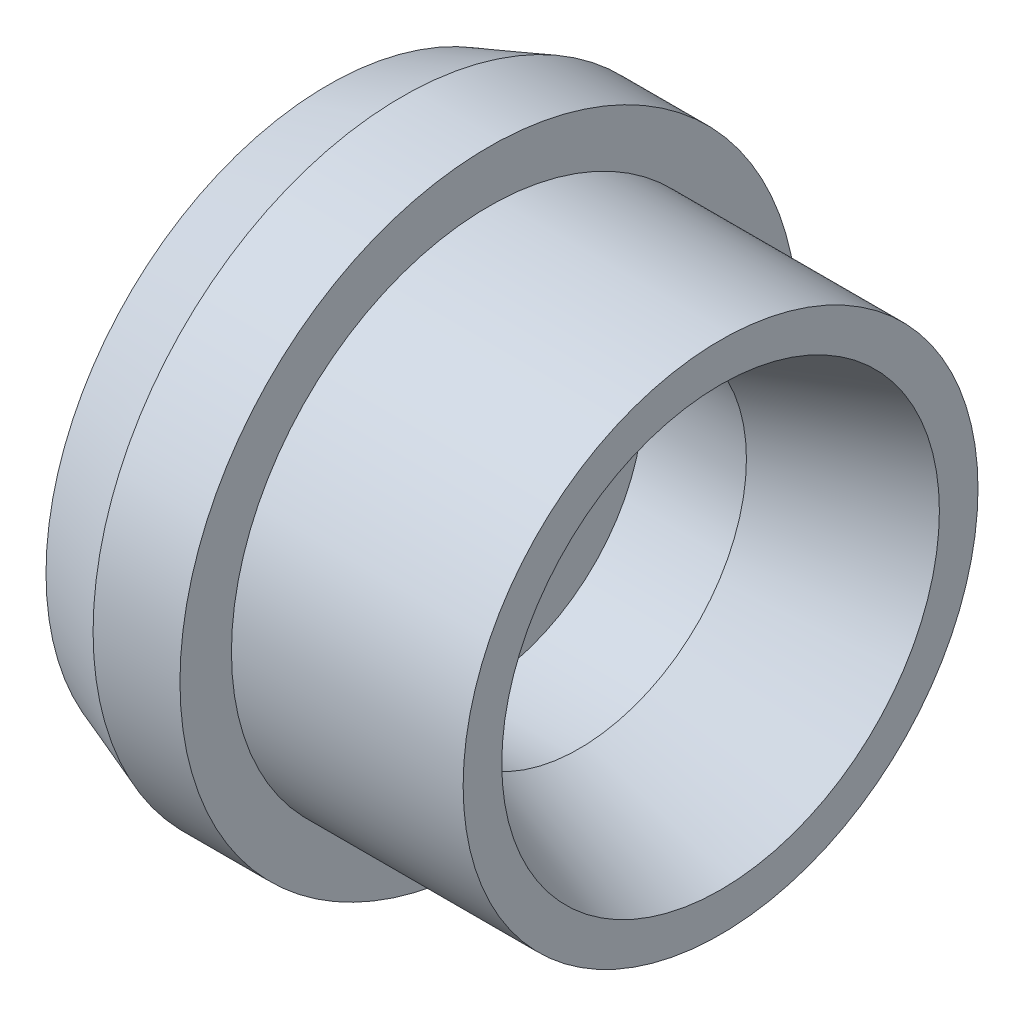
ISO-10303-21;
HEADER;
FILE_DESCRIPTION(('STEP AP214'),'2;1');
FILE_NAME('part.step','',(''),(''),'','','');
FILE_SCHEMA(('AUTOMOTIVE_DESIGN { 1 0 10303 214 1 1 1 1 }'));
ENDSEC;
DATA;
#1=APPLICATION_CONTEXT('core data for automotive mechanical design processes');
#2=APPLICATION_PROTOCOL_DEFINITION('international standard','automotive_design',2000,#1);
#3=PRODUCT_CONTEXT('',#1,'mechanical');
#4=PRODUCT('Part','Part','',(#3));
#5=PRODUCT_RELATED_PRODUCT_CATEGORY('part','',(#4));
#6=PRODUCT_DEFINITION_FORMATION('','',#4);
#7=PRODUCT_DEFINITION_CONTEXT('part definition',#1,'design');
#8=PRODUCT_DEFINITION('design','',#6,#7);
#9=PRODUCT_DEFINITION_SHAPE('','',#8);
#10=(LENGTH_UNIT() NAMED_UNIT(*) SI_UNIT(.MILLI.,.METRE.));
#11=(NAMED_UNIT(*) PLANE_ANGLE_UNIT() SI_UNIT($,.RADIAN.));
#12=(NAMED_UNIT(*) SI_UNIT($,.STERADIAN.) SOLID_ANGLE_UNIT());
#13=UNCERTAINTY_MEASURE_WITH_UNIT(LENGTH_MEASURE(1.E-05),#10,'distance_accuracy_value','');
#14=(GEOMETRIC_REPRESENTATION_CONTEXT(3) GLOBAL_UNCERTAINTY_ASSIGNED_CONTEXT((#13)) GLOBAL_UNIT_ASSIGNED_CONTEXT((#10,
#11,#12)) REPRESENTATION_CONTEXT('',''));
#15=CARTESIAN_POINT('',(0.,0.,0.));
#16=DIRECTION('',(0.,0.,1.));
#17=DIRECTION('',(1.,0.,0.));
#18=AXIS2_PLACEMENT_3D('',#15,#16,#17);
#19=CARTESIAN_POINT('',(0.,0.,0.));
#20=DIRECTION('',(-1.,0.,0.));
#21=DIRECTION('',(0.,0.,1.));
#22=AXIS2_PLACEMENT_3D('',#19,#20,#21);
#23=PLANE('',#22);
#24=CARTESIAN_POINT('',(0.,0.,0.));
#25=DIRECTION('',(1.,0.,0.));
#26=DIRECTION('',(0.,0.,-1.));
#27=AXIS2_PLACEMENT_3D('',#24,#25,#26);
#28=CIRCLE('',#27,5.56442147285421);
#29=CARTESIAN_POINT('',(0.,0.,-5.56442147285421));
#30=VERTEX_POINT('',#29);
#31=EDGE_CURVE('E10',#30,#30,#28,.T.);
#32=ORIENTED_EDGE('',*,*,#31,.F.);
#33=EDGE_LOOP('',(#32));
#34=FACE_BOUND('',#33,.T.);
#35=ADVANCED_FACE('F34',(#34),#23,.T.);
#36=CARTESIAN_POINT('',(1.4605,0.,0.));
#37=DIRECTION('',(1.,0.,0.));
#38=DIRECTION('',(0.,0.,-1.));
#39=AXIS2_PLACEMENT_3D('',#36,#37,#38);
#40=CONICAL_SURFACE('',#39,6.096,0.349065850398867);
#41=ORIENTED_EDGE('',*,*,#31,.T.);
#42=EDGE_LOOP('',(#41));
#43=FACE_BOUND('',#42,.T.);
#44=CARTESIAN_POINT('',(1.4605,0.,0.));
#45=DIRECTION('',(1.,0.,0.));
#46=DIRECTION('',(0.,0.,-1.));
#47=AXIS2_PLACEMENT_3D('',#44,#45,#46);
#48=CIRCLE('',#47,6.096);
#49=CARTESIAN_POINT('',(1.4605,0.,-6.096));
#50=VERTEX_POINT('',#49);
#51=EDGE_CURVE('E40',#50,#50,#48,.T.);
#52=ORIENTED_EDGE('',*,*,#51,.F.);
#53=EDGE_LOOP('',(#52));
#54=FACE_BOUND('',#53,.T.);
#55=ADVANCED_FACE('F82',(#43,#54),#40,.T.);
#56=CARTESIAN_POINT('',(2.921,0.,0.));
#57=DIRECTION('',(1.,0.,0.));
#58=DIRECTION('',(0.,0.,-1.));
#59=AXIS2_PLACEMENT_3D('',#56,#57,#58);
#60=CYLINDRICAL_SURFACE('',#59,6.096);
#61=ORIENTED_EDGE('',*,*,#51,.T.);
#62=EDGE_LOOP('',(#61));
#63=FACE_BOUND('',#62,.T.);
#64=CARTESIAN_POINT('',(3.175,0.,0.));
#65=DIRECTION('',(1.,0.,0.));
#66=DIRECTION('',(0.,0.,-1.));
#67=AXIS2_PLACEMENT_3D('',#64,#65,#66);
#68=CIRCLE('',#67,6.096);
#69=CARTESIAN_POINT('',(3.175,0.,-6.096));
#70=VERTEX_POINT('',#69);
#71=EDGE_CURVE('E44',#70,#70,#68,.T.);
#72=ORIENTED_EDGE('',*,*,#71,.F.);
#73=EDGE_LOOP('',(#72));
#74=FACE_BOUND('',#73,.T.);
#75=ADVANCED_FACE('F87',(#63,#74),#60,.T.);
#76=CARTESIAN_POINT('',(3.175,6.096,0.));
#77=DIRECTION('',(1.,0.,0.));
#78=DIRECTION('',(0.,0.,-1.));
#79=AXIS2_PLACEMENT_3D('',#76,#77,#78);
#80=PLANE('',#79);
#81=ORIENTED_EDGE('',*,*,#71,.T.);
#82=EDGE_LOOP('',(#81));
#83=FACE_BOUND('',#82,.T.);
#84=CARTESIAN_POINT('',(3.175,0.,0.));
#85=DIRECTION('',(1.,0.,0.));
#86=DIRECTION('',(0.,0.,-1.));
#87=AXIS2_PLACEMENT_3D('',#84,#85,#86);
#88=CIRCLE('',#87,5.08);
#89=CARTESIAN_POINT('',(3.175,0.,-5.08));
#90=VERTEX_POINT('',#89);
#91=EDGE_CURVE('E48',#90,#90,#88,.T.);
#92=ORIENTED_EDGE('',*,*,#91,.F.);
#93=EDGE_LOOP('',(#92));
#94=FACE_BOUND('',#93,.T.);
#95=ADVANCED_FACE('F91',(#83,#94),#80,.T.);
#96=CARTESIAN_POINT('',(2.921,0.,0.));
#97=DIRECTION('',(1.,0.,0.));
#98=DIRECTION('',(0.,0.,-1.));
#99=AXIS2_PLACEMENT_3D('',#96,#97,#98);
#100=CYLINDRICAL_SURFACE('',#99,5.08);
#101=ORIENTED_EDGE('',*,*,#91,.T.);
#102=EDGE_LOOP('',(#101));
#103=FACE_BOUND('',#102,.T.);
#104=CARTESIAN_POINT('',(7.747,0.,0.));
#105=DIRECTION('',(1.,0.,0.));
#106=DIRECTION('',(0.,0.,-1.));
#107=AXIS2_PLACEMENT_3D('',#104,#105,#106);
#108=CIRCLE('',#107,5.08);
#109=CARTESIAN_POINT('',(7.747,0.,-5.08));
#110=VERTEX_POINT('',#109);
#111=EDGE_CURVE('E53',#110,#110,#108,.T.);
#112=ORIENTED_EDGE('',*,*,#111,.F.);
#113=EDGE_LOOP('',(#112));
#114=FACE_BOUND('',#113,.T.);
#115=ADVANCED_FACE('F97',(#103,#114),#100,.T.);
#116=CARTESIAN_POINT('',(7.747,5.08,0.));
#117=DIRECTION('',(1.,0.,0.));
#118=DIRECTION('',(0.,0.,-1.));
#119=AXIS2_PLACEMENT_3D('',#116,#117,#118);
#120=PLANE('',#119);
#121=ORIENTED_EDGE('',*,*,#111,.T.);
#122=EDGE_LOOP('',(#121));
#123=FACE_BOUND('',#122,.T.);
#124=CARTESIAN_POINT('',(7.747,0.,0.));
#125=DIRECTION('',(1.,0.,0.));
#126=DIRECTION('',(0.,0.,-1.));
#127=AXIS2_PLACEMENT_3D('',#124,#125,#126);
#128=CIRCLE('',#127,4.318);
#129=CARTESIAN_POINT('',(7.747,0.,-4.318));
#130=VERTEX_POINT('',#129);
#131=EDGE_CURVE('E56',#130,#130,#128,.T.);
#132=ORIENTED_EDGE('',*,*,#131,.F.);
#133=EDGE_LOOP('',(#132));
#134=FACE_BOUND('',#133,.T.);
#135=ADVANCED_FACE('F78',(#123,#134),#120,.T.);
#136=CARTESIAN_POINT('',(4.95556294183411,0.,0.));
#137=DIRECTION('',(1.,0.,0.));
#138=DIRECTION('',(0.,0.,-1.));
#139=AXIS2_PLACEMENT_3D('',#136,#137,#138);
#140=CONICAL_SURFACE('',#139,3.302,0.349065850398867);
#141=ORIENTED_EDGE('',*,*,#131,.T.);
#142=EDGE_LOOP('',(#141));
#143=FACE_BOUND('',#142,.T.);
#144=CARTESIAN_POINT('',(4.95556294183411,0.,0.));
#145=DIRECTION('',(1.,0.,0.));
#146=DIRECTION('',(0.,0.,-1.));
#147=AXIS2_PLACEMENT_3D('',#144,#145,#146);
#148=CIRCLE('',#147,3.302);
#149=CARTESIAN_POINT('',(4.95556294183411,0.,-3.302));
#150=VERTEX_POINT('',#149);
#151=EDGE_CURVE('E59',#150,#150,#148,.T.);
#152=ORIENTED_EDGE('',*,*,#151,.F.);
#153=EDGE_LOOP('',(#152));
#154=FACE_BOUND('',#153,.T.);
#155=ADVANCED_FACE('F70',(#143,#154),#140,.F.);
#156=CARTESIAN_POINT('',(2.921,0.,0.));
#157=DIRECTION('',(1.,0.,0.));
#158=DIRECTION('',(0.,0.,-1.));
#159=AXIS2_PLACEMENT_3D('',#156,#157,#158);
#160=CYLINDRICAL_SURFACE('',#159,3.302);
#161=ORIENTED_EDGE('',*,*,#151,.T.);
#162=EDGE_LOOP('',(#161));
#163=FACE_BOUND('',#162,.T.);
#164=CARTESIAN_POINT('',(2.921,0.,0.));
#165=DIRECTION('',(1.,0.,0.));
#166=DIRECTION('',(0.,0.,-1.));
#167=AXIS2_PLACEMENT_3D('',#164,#165,#166);
#168=CIRCLE('',#167,3.302);
#169=CARTESIAN_POINT('',(2.921,0.,-3.302));
#170=VERTEX_POINT('',#169);
#171=EDGE_CURVE('E62',#170,#170,#168,.T.);
#172=ORIENTED_EDGE('',*,*,#171,.F.);
#173=EDGE_LOOP('',(#172));
#174=FACE_BOUND('',#173,.T.);
#175=ADVANCED_FACE('F68',(#163,#174),#160,.F.);
#176=CARTESIAN_POINT('',(2.921,3.302,0.));
#177=DIRECTION('',(1.,0.,0.));
#178=DIRECTION('',(0.,0.,-1.));
#179=AXIS2_PLACEMENT_3D('',#176,#177,#178);
#180=PLANE('',#179);
#181=ORIENTED_EDGE('',*,*,#171,.T.);
#182=EDGE_LOOP('',(#181));
#183=FACE_BOUND('',#182,.T.);
#184=ADVANCED_FACE('F66',(#183),#180,.T.);
#185=CLOSED_SHELL('',(#35,#55,#75,#95,#115,#135,#155,#175,#184));
#186=MANIFOLD_SOLID_BREP('B2',#185);
#187=ADVANCED_BREP_SHAPE_REPRESENTATION('',(#18,#186),#14);
#188=SHAPE_DEFINITION_REPRESENTATION(#9,#187);
ENDSEC;
END-ISO-10303-21;
